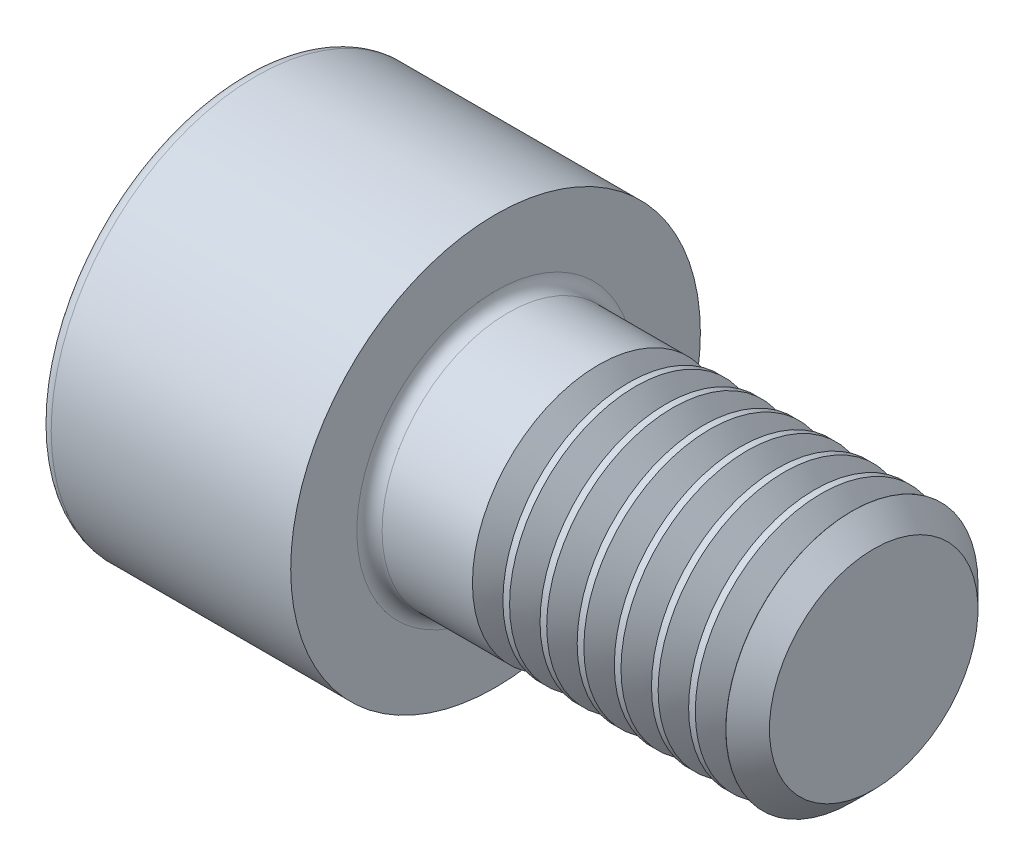
ISO-10303-21;
HEADER;
FILE_DESCRIPTION(('STEP AP214'),'2;1');
FILE_NAME('part.step','',(''),(''),'','','');
FILE_SCHEMA(('AUTOMOTIVE_DESIGN { 1 0 10303 214 1 1 1 1 }'));
ENDSEC;
DATA;
#1=APPLICATION_CONTEXT('core data for automotive mechanical design processes');
#2=APPLICATION_PROTOCOL_DEFINITION('international standard','automotive_design',2000,#1);
#3=PRODUCT_CONTEXT('',#1,'mechanical');
#4=PRODUCT('Part','Part','',(#3));
#5=PRODUCT_RELATED_PRODUCT_CATEGORY('part','',(#4));
#6=PRODUCT_DEFINITION_FORMATION('','',#4);
#7=PRODUCT_DEFINITION_CONTEXT('part definition',#1,'design');
#8=PRODUCT_DEFINITION('design','',#6,#7);
#9=PRODUCT_DEFINITION_SHAPE('','',#8);
#10=(LENGTH_UNIT() NAMED_UNIT(*) SI_UNIT(.MILLI.,.METRE.));
#11=(NAMED_UNIT(*) PLANE_ANGLE_UNIT() SI_UNIT($,.RADIAN.));
#12=(NAMED_UNIT(*) SI_UNIT($,.STERADIAN.) SOLID_ANGLE_UNIT());
#13=UNCERTAINTY_MEASURE_WITH_UNIT(LENGTH_MEASURE(1.E-05),#10,'distance_accuracy_value','');
#14=(GEOMETRIC_REPRESENTATION_CONTEXT(3) GLOBAL_UNCERTAINTY_ASSIGNED_CONTEXT((#13)) GLOBAL_UNIT_ASSIGNED_CONTEXT((#10,
#11,#12)) REPRESENTATION_CONTEXT('',''));
#15=CARTESIAN_POINT('',(0.,0.,0.));
#16=DIRECTION('',(0.,0.,1.));
#17=DIRECTION('',(1.,0.,0.));
#18=AXIS2_PLACEMENT_3D('',#15,#16,#17);
#19=CARTESIAN_POINT('',(5.759474945,0.,0.));
#20=DIRECTION('',(-1.,0.,0.));
#21=DIRECTION('',(0.,0.,1.));
#22=AXIS2_PLACEMENT_3D('',#19,#20,#21);
#23=CONICAL_SURFACE('',#22,0.,1.04719755128406);
#24=CARTESIAN_POINT('',(5.759474945,0.,0.));
#25=VERTEX_POINT('',#24);
#26=VERTEX_LOOP('',#25);
#27=FACE_BOUND('',#26,.T.);
#28=CARTESIAN_POINT('',(4.,0.,0.));
#29=DIRECTION('',(-1.,0.,0.));
#30=DIRECTION('',(0.,0.,1.));
#31=AXIS2_PLACEMENT_3D('',#28,#29,#30);
#32=CIRCLE('',#31,3.0475);
#33=CARTESIAN_POINT('',(4.,2.63921241786676,1.52375000025943));
#34=VERTEX_POINT('',#33);
#35=CARTESIAN_POINT('',(4.,2.63921241819937,-1.52374999968332));
#36=VERTEX_POINT('',#35);
#37=EDGE_CURVE('E88',#34,#36,#32,.T.);
#38=ORIENTED_EDGE('',*,*,#37,.T.);
#39=CARTESIAN_POINT('',(4.,0.,0.));
#40=DIRECTION('',(-1.,0.,0.));
#41=DIRECTION('',(0.,0.,1.));
#42=AXIS2_PLACEMENT_3D('',#39,#40,#41);
#43=CIRCLE('',#42,3.0475);
#44=CARTESIAN_POINT('',(4.,-6.2505269840047E-10,-3.0475));
#45=VERTEX_POINT('',#44);
#46=EDGE_CURVE('E91',#36,#45,#43,.T.);
#47=ORIENTED_EDGE('',*,*,#46,.T.);
#48=CARTESIAN_POINT('',(4.,0.,0.));
#49=DIRECTION('',(-1.,0.,0.));
#50=DIRECTION('',(0.,0.,1.));
#51=AXIS2_PLACEMENT_3D('',#48,#49,#50);
#52=CIRCLE('',#51,3.04749999999999);
#53=CARTESIAN_POINT('',(4.,-2.63921241806255,-1.5237499999203));
#54=VERTEX_POINT('',#53);
#55=EDGE_CURVE('E96',#45,#54,#52,.T.);
#56=ORIENTED_EDGE('',*,*,#55,.T.);
#57=CARTESIAN_POINT('',(4.,0.,0.));
#58=DIRECTION('',(-1.,0.,0.));
#59=DIRECTION('',(0.,0.,1.));
#60=AXIS2_PLACEMENT_3D('',#57,#58,#59);
#61=CIRCLE('',#60,3.0475);
#62=CARTESIAN_POINT('',(4.,-2.63921241788327,1.52375000020218));
#63=VERTEX_POINT('',#62);
#64=EDGE_CURVE('E225',#54,#63,#61,.T.);
#65=ORIENTED_EDGE('',*,*,#64,.T.);
#66=CARTESIAN_POINT('',(4.,0.,0.));
#67=DIRECTION('',(-1.,0.,0.));
#68=DIRECTION('',(0.,0.,1.));
#69=AXIS2_PLACEMENT_3D('',#66,#67,#68);
#70=CIRCLE('',#69,3.0475);
#71=CARTESIAN_POINT('',(4.,-2.73646082636564E-10,3.0475));
#72=VERTEX_POINT('',#71);
#73=EDGE_CURVE('E77',#63,#72,#70,.T.);
#74=ORIENTED_EDGE('',*,*,#73,.T.);
#75=CARTESIAN_POINT('',(4.,0.,0.));
#76=DIRECTION('',(-1.,0.,0.));
#77=DIRECTION('',(0.,0.,1.));
#78=AXIS2_PLACEMENT_3D('',#75,#76,#77);
#79=CIRCLE('',#78,3.0475);
#80=EDGE_CURVE('E20',#72,#34,#79,.T.);
#81=ORIENTED_EDGE('',*,*,#80,.T.);
#82=EDGE_LOOP('',(#38,#47,#56,#65,#74,#81));
#83=FACE_BOUND('',#82,.T.);
#84=ADVANCED_FACE('F16',(#27,#83),#23,.F.);
#85=CARTESIAN_POINT('',(4.,-0.015835275,3.0475));
#86=DIRECTION('',(1.,0.,0.));
#87=DIRECTION('',(0.,0.,-1.));
#88=AXIS2_PLACEMENT_3D('',#85,#86,#87);
#89=PLANE('',#88);
#90=DIRECTION('',(0.,-0.500000000137388,0.866025403705118));
#91=VECTOR('',#90,1.);
#92=CARTESIAN_POINT('',(4.,2.639212418,1.52375));
#93=LINE('',#92,#91);
#94=CARTESIAN_POINT('',(4.,1.75947494501155,3.04749999997999));
#95=VERTEX_POINT('',#94);
#96=EDGE_CURVE('E137',#34,#95,#93,.T.);
#97=ORIENTED_EDGE('',*,*,#96,.F.);
#98=ORIENTED_EDGE('',*,*,#80,.F.);
#99=DIRECTION('',(0.,1.,0.));
#100=VECTOR('',#99,1.);
#101=CARTESIAN_POINT('',(4.,0.,3.0475));
#102=LINE('',#101,#100);
#103=EDGE_CURVE('E179',#72,#95,#102,.T.);
#104=ORIENTED_EDGE('',*,*,#103,.T.);
#105=EDGE_LOOP('',(#97,#98,#104));
#106=FACE_BOUND('',#105,.T.);
#107=ADVANCED_FACE('F86',(#106),#89,.F.);
#108=CARTESIAN_POINT('',(4.,-2.655047693,3.0475));
#109=DIRECTION('',(1.,0.,0.));
#110=DIRECTION('',(0.,0.,-1.));
#111=AXIS2_PLACEMENT_3D('',#108,#109,#110);
#112=PLANE('',#111);
#113=DIRECTION('',(0.,1.,0.));
#114=VECTOR('',#113,1.);
#115=CARTESIAN_POINT('',(4.,0.,3.0475));
#116=LINE('',#115,#114);
#117=CARTESIAN_POINT('',(4.,-1.759474945,3.0475));
#118=VERTEX_POINT('',#117);
#119=EDGE_CURVE('E177',#118,#72,#116,.T.);
#120=ORIENTED_EDGE('',*,*,#119,.T.);
#121=ORIENTED_EDGE('',*,*,#73,.F.);
#122=DIRECTION('',(0.,-0.500000000137388,-0.866025403705118));
#123=VECTOR('',#122,1.);
#124=CARTESIAN_POINT('',(4.,-2.639212418,1.52375));
#125=LINE('',#124,#123);
#126=EDGE_CURVE('E164',#118,#63,#125,.T.);
#127=ORIENTED_EDGE('',*,*,#126,.F.);
#128=EDGE_LOOP('',(#120,#121,#127));
#129=FACE_BOUND('',#128,.T.);
#130=ADVANCED_FACE('F233',(#129),#112,.F.);
#131=CARTESIAN_POINT('',(4.,-3.524228316,1.542035));
#132=DIRECTION('',(1.,0.,0.));
#133=DIRECTION('',(0.,0.,-1.));
#134=AXIS2_PLACEMENT_3D('',#131,#132,#133);
#135=PLANE('',#134);
#136=DIRECTION('',(0.,-0.500000000137388,-0.866025403705118));
#137=VECTOR('',#136,1.);
#138=CARTESIAN_POINT('',(4.,-2.639212418,1.52375));
#139=LINE('',#138,#137);
#140=CARTESIAN_POINT('',(4.,-3.518949891,0.));
#141=VERTEX_POINT('',#140);
#142=EDGE_CURVE('E159',#63,#141,#139,.T.);
#143=ORIENTED_EDGE('',*,*,#142,.F.);
#144=ORIENTED_EDGE('',*,*,#64,.F.);
#145=DIRECTION('',(0.,0.500000000137388,-0.866025403705118));
#146=VECTOR('',#145,1.);
#147=CARTESIAN_POINT('',(4.,-2.639212418,-1.52375));
#148=LINE('',#147,#146);
#149=EDGE_CURVE('E146',#141,#54,#148,.T.);
#150=ORIENTED_EDGE('',*,*,#149,.F.);
#151=EDGE_LOOP('',(#143,#144,#150));
#152=FACE_BOUND('',#151,.T.);
#153=ADVANCED_FACE('F235',(#152),#135,.F.);
#154=CARTESIAN_POINT('',(4.,-2.655047693,-1.5146075));
#155=DIRECTION('',(1.,0.,0.));
#156=DIRECTION('',(0.,0.,-1.));
#157=AXIS2_PLACEMENT_3D('',#154,#155,#156);
#158=PLANE('',#157);
#159=DIRECTION('',(0.,0.500000000137388,-0.866025403705118));
#160=VECTOR('',#159,1.);
#161=CARTESIAN_POINT('',(4.,-2.639212418,-1.52375));
#162=LINE('',#161,#160);
#163=CARTESIAN_POINT('',(4.,-1.75947494501155,-3.04749999997999));
#164=VERTEX_POINT('',#163);
#165=EDGE_CURVE('E127',#54,#164,#162,.T.);
#166=ORIENTED_EDGE('',*,*,#165,.F.);
#167=ORIENTED_EDGE('',*,*,#55,.F.);
#168=DIRECTION('',(0.,-1.,0.));
#169=VECTOR('',#168,1.);
#170=CARTESIAN_POINT('',(4.,0.,-3.0475));
#171=LINE('',#170,#169);
#172=EDGE_CURVE('E126',#45,#164,#171,.T.);
#173=ORIENTED_EDGE('',*,*,#172,.T.);
#174=EDGE_LOOP('',(#166,#167,#173));
#175=FACE_BOUND('',#174,.T.);
#176=ADVANCED_FACE('F259',(#175),#158,.F.);
#177=CARTESIAN_POINT('',(4.,2.633933993,1.542035));
#178=DIRECTION('',(1.,0.,0.));
#179=DIRECTION('',(0.,0.,-1.));
#180=AXIS2_PLACEMENT_3D('',#177,#178,#179);
#181=PLANE('',#180);
#182=DIRECTION('',(0.,-0.500000000137388,-0.866025403705118));
#183=VECTOR('',#182,1.);
#184=CARTESIAN_POINT('',(4.,2.639212418,-1.52375));
#185=LINE('',#184,#183);
#186=CARTESIAN_POINT('',(4.,3.518949891,0.));
#187=VERTEX_POINT('',#186);
#188=EDGE_CURVE('E99',#187,#36,#185,.T.);
#189=ORIENTED_EDGE('',*,*,#188,.T.);
#190=ORIENTED_EDGE('',*,*,#37,.F.);
#191=DIRECTION('',(0.,-0.500000000137388,0.866025403705118));
#192=VECTOR('',#191,1.);
#193=CARTESIAN_POINT('',(4.,2.639212418,1.52375));
#194=LINE('',#193,#192);
#195=EDGE_CURVE('E102',#187,#34,#194,.T.);
#196=ORIENTED_EDGE('',*,*,#195,.F.);
#197=EDGE_LOOP('',(#189,#190,#196));
#198=FACE_BOUND('',#197,.T.);
#199=ADVANCED_FACE('F100',(#198),#181,.F.);
#200=CARTESIAN_POINT('',(4.,-0.015835275,-1.5146075));
#201=DIRECTION('',(1.,0.,0.));
#202=DIRECTION('',(0.,0.,-1.));
#203=AXIS2_PLACEMENT_3D('',#200,#201,#202);
#204=PLANE('',#203);
#205=DIRECTION('',(0.,-1.,0.));
#206=VECTOR('',#205,1.);
#207=CARTESIAN_POINT('',(4.,0.,-3.0475));
#208=LINE('',#207,#206);
#209=CARTESIAN_POINT('',(4.,1.7594749450462,-3.0475));
#210=VERTEX_POINT('',#209);
#211=EDGE_CURVE('E113',#210,#45,#208,.T.);
#212=ORIENTED_EDGE('',*,*,#211,.T.);
#213=ORIENTED_EDGE('',*,*,#46,.F.);
#214=DIRECTION('',(0.,-0.500000000137388,-0.866025403705118));
#215=VECTOR('',#214,1.);
#216=CARTESIAN_POINT('',(4.,2.639212418,-1.52375));
#217=LINE('',#216,#215);
#218=EDGE_CURVE('E107',#36,#210,#217,.T.);
#219=ORIENTED_EDGE('',*,*,#218,.T.);
#220=EDGE_LOOP('',(#212,#213,#219));
#221=FACE_BOUND('',#220,.T.);
#222=ADVANCED_FACE('F112',(#221),#204,.F.);
#223=CARTESIAN_POINT('',(0.,1.759474945,3.0475));
#224=DIRECTION('',(0.,-0.866025403705118,-0.500000000137388));
#225=DIRECTION('',(0.,0.500000000137388,-0.866025403705118));
#226=AXIS2_PLACEMENT_3D('',#223,#224,#225);
#227=PLANE('',#226);
#228=ORIENTED_EDGE('',*,*,#96,.T.);
#229=DIRECTION('',(-1.,0.,0.));
#230=VECTOR('',#229,1.);
#231=CARTESIAN_POINT('',(2.,1.759474945,3.0475));
#232=LINE('',#231,#230);
#233=CARTESIAN_POINT('',(0.,1.75947494497842,3.04750000034787));
#234=VERTEX_POINT('',#233);
#235=EDGE_CURVE('E174',#95,#234,#232,.T.);
#236=ORIENTED_EDGE('',*,*,#235,.T.);
#237=DIRECTION('',(0.,-0.499999999816707,0.866025403890263));
#238=VECTOR('',#237,1.);
#239=CARTESIAN_POINT('',(0.,3.5189498897344,0.));
#240=LINE('',#239,#238);
#241=CARTESIAN_POINT('',(0.,3.5189498901299,-1.37004802676075E-10));
#242=VERTEX_POINT('',#241);
#243=EDGE_CURVE('E118',#242,#234,#240,.T.);
#244=ORIENTED_EDGE('',*,*,#243,.F.);
#245=DIRECTION('',(1.,0.,0.));
#246=VECTOR('',#245,1.);
#247=CARTESIAN_POINT('',(2.,3.518949891,0.));
#248=LINE('',#247,#246);
#249=EDGE_CURVE('E108',#242,#187,#248,.T.);
#250=ORIENTED_EDGE('',*,*,#249,.T.);
#251=ORIENTED_EDGE('',*,*,#195,.T.);
#252=EDGE_LOOP('',(#228,#236,#244,#250,#251));
#253=FACE_BOUND('',#252,.T.);
#254=ADVANCED_FACE('F247',(#253),#227,.T.);
#255=CARTESIAN_POINT('',(0.,1.759474945,3.0475));
#256=DIRECTION('',(0.,0.,1.));
#257=DIRECTION('',(0.,-1.,0.));
#258=AXIS2_PLACEMENT_3D('',#255,#256,#257);
#259=PLANE('',#258);
#260=ORIENTED_EDGE('',*,*,#235,.F.);
#261=ORIENTED_EDGE('',*,*,#103,.F.);
#262=ORIENTED_EDGE('',*,*,#119,.F.);
#263=DIRECTION('',(1.,0.,0.));
#264=VECTOR('',#263,1.);
#265=CARTESIAN_POINT('',(2.,-1.759474945,3.0475));
#266=LINE('',#265,#264);
#267=CARTESIAN_POINT('',(0.,-1.75947494497842,3.04750000034787));
#268=VERTEX_POINT('',#267);
#269=EDGE_CURVE('E169',#268,#118,#266,.T.);
#270=ORIENTED_EDGE('',*,*,#269,.F.);
#271=DIRECTION('',(0.,-1.,0.));
#272=VECTOR('',#271,1.);
#273=CARTESIAN_POINT('',(0.,0.,3.047500000644));
#274=LINE('',#273,#272);
#275=EDGE_CURVE('E182',#234,#268,#274,.T.);
#276=ORIENTED_EDGE('',*,*,#275,.F.);
#277=EDGE_LOOP('',(#260,#261,#262,#270,#276));
#278=FACE_BOUND('',#277,.T.);
#279=ADVANCED_FACE('F243',(#278),#259,.F.);
#280=CARTESIAN_POINT('',(0.,-3.518949891,0.));
#281=DIRECTION('',(0.,0.866025403705118,-0.500000000137388));
#282=DIRECTION('',(0.,0.500000000137388,0.866025403705118));
#283=AXIS2_PLACEMENT_3D('',#280,#281,#282);
#284=PLANE('',#283);
#285=ORIENTED_EDGE('',*,*,#142,.T.);
#286=DIRECTION('',(1.,0.,0.));
#287=VECTOR('',#286,1.);
#288=CARTESIAN_POINT('',(2.,-3.518949891,0.));
#289=LINE('',#288,#287);
#290=CARTESIAN_POINT('',(0.,-3.5189498901299,-1.37005424366565E-10));
#291=VERTEX_POINT('',#290);
#292=EDGE_CURVE('E154',#291,#141,#289,.T.);
#293=ORIENTED_EDGE('',*,*,#292,.F.);
#294=DIRECTION('',(0.,-0.499999999816707,-0.866025403890263));
#295=VECTOR('',#294,1.);
#296=CARTESIAN_POINT('',(0.,-1.7594749448672,3.047500000644));
#297=LINE('',#296,#295);
#298=EDGE_CURVE('E185',#268,#291,#297,.T.);
#299=ORIENTED_EDGE('',*,*,#298,.F.);
#300=ORIENTED_EDGE('',*,*,#269,.T.);
#301=ORIENTED_EDGE('',*,*,#126,.T.);
#302=EDGE_LOOP('',(#285,#293,#299,#300,#301));
#303=FACE_BOUND('',#302,.T.);
#304=ADVANCED_FACE('F237',(#303),#284,.T.);
#305=CARTESIAN_POINT('',(0.,-1.759474945,-3.0475));
#306=DIRECTION('',(0.,0.866025403705118,0.500000000137388));
#307=DIRECTION('',(0.,-0.500000000137388,0.866025403705118));
#308=AXIS2_PLACEMENT_3D('',#305,#306,#307);
#309=PLANE('',#308);
#310=ORIENTED_EDGE('',*,*,#165,.T.);
#311=DIRECTION('',(-1.,0.,0.));
#312=VECTOR('',#311,1.);
#313=CARTESIAN_POINT('',(2.,-1.759474945,-3.0475));
#314=LINE('',#313,#312);
#315=CARTESIAN_POINT('',(0.,-1.75947494497842,-3.04750000034787));
#316=VERTEX_POINT('',#315);
#317=EDGE_CURVE('E133',#164,#316,#314,.T.);
#318=ORIENTED_EDGE('',*,*,#317,.T.);
#319=DIRECTION('',(0.,0.499999999816707,-0.866025403890263));
#320=VECTOR('',#319,1.);
#321=CARTESIAN_POINT('',(0.,-3.5189498897344,0.));
#322=LINE('',#321,#320);
#323=EDGE_CURVE('E200',#291,#316,#322,.T.);
#324=ORIENTED_EDGE('',*,*,#323,.F.);
#325=ORIENTED_EDGE('',*,*,#292,.T.);
#326=ORIENTED_EDGE('',*,*,#149,.T.);
#327=EDGE_LOOP('',(#310,#318,#324,#325,#326));
#328=FACE_BOUND('',#327,.T.);
#329=ADVANCED_FACE('F257',(#328),#309,.T.);
#330=CARTESIAN_POINT('',(0.,-1.759474945,-3.0475));
#331=DIRECTION('',(0.,0.,-1.));
#332=DIRECTION('',(0.,1.,0.));
#333=AXIS2_PLACEMENT_3D('',#330,#331,#332);
#334=PLANE('',#333);
#335=ORIENTED_EDGE('',*,*,#317,.F.);
#336=ORIENTED_EDGE('',*,*,#172,.F.);
#337=ORIENTED_EDGE('',*,*,#211,.F.);
#338=DIRECTION('',(-1.,0.,0.));
#339=VECTOR('',#338,1.);
#340=CARTESIAN_POINT('',(2.,1.759474945,-3.0475));
#341=LINE('',#340,#339);
#342=CARTESIAN_POINT('',(0.,1.75947494497842,-3.04750000034787));
#343=VERTEX_POINT('',#342);
#344=EDGE_CURVE('E35',#210,#343,#341,.T.);
#345=ORIENTED_EDGE('',*,*,#344,.T.);
#346=DIRECTION('',(0.,1.,0.));
#347=VECTOR('',#346,1.);
#348=CARTESIAN_POINT('',(0.,0.,-3.047500000644));
#349=LINE('',#348,#347);
#350=EDGE_CURVE('E196',#316,#343,#349,.T.);
#351=ORIENTED_EDGE('',*,*,#350,.F.);
#352=EDGE_LOOP('',(#335,#336,#337,#345,#351));
#353=FACE_BOUND('',#352,.T.);
#354=ADVANCED_FACE('F253',(#353),#334,.F.);
#355=CARTESIAN_POINT('',(0.,1.759474945,-3.0475));
#356=DIRECTION('',(0.,0.866025403705118,-0.500000000137388));
#357=DIRECTION('',(0.,0.500000000137388,0.866025403705118));
#358=AXIS2_PLACEMENT_3D('',#355,#356,#357);
#359=PLANE('',#358);
#360=ORIENTED_EDGE('',*,*,#344,.F.);
#361=ORIENTED_EDGE('',*,*,#218,.F.);
#362=ORIENTED_EDGE('',*,*,#188,.F.);
#363=ORIENTED_EDGE('',*,*,#249,.F.);
#364=DIRECTION('',(0.,0.499999999816707,0.866025403890263));
#365=VECTOR('',#364,1.);
#366=CARTESIAN_POINT('',(0.,1.7594749448672,-3.047500000644));
#367=LINE('',#366,#365);
#368=EDGE_CURVE('E199',#343,#242,#367,.T.);
#369=ORIENTED_EDGE('',*,*,#368,.F.);
#370=EDGE_LOOP('',(#360,#361,#362,#363,#369));
#371=FACE_BOUND('',#370,.T.);
#372=ADVANCED_FACE('F116',(#371),#359,.F.);
#373=CARTESIAN_POINT('',(0.,-6.1732,-6.1732));
#374=DIRECTION('',(-1.,0.,0.));
#375=DIRECTION('',(0.,0.,1.));
#376=AXIS2_PLACEMENT_3D('',#373,#374,#375);
#377=PLANE('',#376);
#378=ORIENTED_EDGE('',*,*,#350,.T.);
#379=ORIENTED_EDGE('',*,*,#368,.T.);
#380=ORIENTED_EDGE('',*,*,#243,.T.);
#381=ORIENTED_EDGE('',*,*,#275,.T.);
#382=ORIENTED_EDGE('',*,*,#298,.T.);
#383=ORIENTED_EDGE('',*,*,#323,.T.);
#384=EDGE_LOOP('',(#378,#379,#380,#381,#382,#383));
#385=FACE_BOUND('',#384,.T.);
#386=CARTESIAN_POINT('',(1.10787518482064E-10,0.,0.));
#387=DIRECTION('',(-1.,0.,0.));
#388=DIRECTION('',(0.,0.,1.));
#389=AXIS2_PLACEMENT_3D('',#386,#387,#388);
#390=CIRCLE('',#389,6.09999999965447);
#391=CARTESIAN_POINT('',(1.10787518482064E-10,0.,6.09999999965447));
#392=VERTEX_POINT('',#391);
#393=EDGE_CURVE('E213',#392,#392,#390,.F.);
#394=ORIENTED_EDGE('',*,*,#393,.F.);
#395=EDGE_LOOP('',(#394));
#396=FACE_BOUND('',#395,.T.);
#397=ADVANCED_FACE('F249',(#385,#396),#377,.T.);
#398=CARTESIAN_POINT('',(0.40000000032627,0.,0.));
#399=DIRECTION('',(-1.,0.,0.));
#400=DIRECTION('',(0.,0.,1.));
#401=AXIS2_PLACEMENT_3D('',#398,#399,#400);
#402=TOROIDAL_SURFACE('',#401,6.09999999967373,0.400000000215483);
#403=CARTESIAN_POINT('',(0.399999999999998,0.,0.));
#404=DIRECTION('',(-1.,0.,0.));
#405=DIRECTION('',(0.,0.,1.));
#406=AXIS2_PLACEMENT_3D('',#403,#404,#405);
#407=CIRCLE('',#406,6.5);
#408=CARTESIAN_POINT('',(0.4,0.,6.5));
#409=VERTEX_POINT('',#408);
#410=EDGE_CURVE('E212',#409,#409,#407,.T.);
#411=ORIENTED_EDGE('',*,*,#410,.T.);
#412=EDGE_LOOP('',(#411));
#413=FACE_BOUND('',#412,.T.);
#414=ORIENTED_EDGE('',*,*,#393,.T.);
#415=EDGE_LOOP('',(#414));
#416=FACE_BOUND('',#415,.T.);
#417=ADVANCED_FACE('F370',(#413,#416),#402,.T.);
#418=CARTESIAN_POINT('',(8.,0.,0.));
#419=DIRECTION('',(-1.,0.,0.));
#420=DIRECTION('',(0.,0.,1.));
#421=AXIS2_PLACEMENT_3D('',#418,#419,#420);
#422=CYLINDRICAL_SURFACE('',#421,6.5);
#423=CARTESIAN_POINT('',(8.,0.,0.));
#424=DIRECTION('',(-1.,0.,0.));
#425=DIRECTION('',(0.,0.,1.));
#426=AXIS2_PLACEMENT_3D('',#423,#424,#425);
#427=CIRCLE('',#426,6.5);
#428=CARTESIAN_POINT('',(8.,0.,6.5));
#429=VERTEX_POINT('',#428);
#430=EDGE_CURVE('E209',#429,#429,#427,.F.);
#431=ORIENTED_EDGE('',*,*,#430,.F.);
#432=EDGE_LOOP('',(#431));
#433=FACE_BOUND('',#432,.T.);
#434=ORIENTED_EDGE('',*,*,#410,.F.);
#435=EDGE_LOOP('',(#434));
#436=FACE_BOUND('',#435,.T.);
#437=ADVANCED_FACE('F367',(#433,#436),#422,.T.);
#438=CARTESIAN_POINT('',(8.,-6.578,6.578));
#439=DIRECTION('',(1.,0.,0.));
#440=DIRECTION('',(0.,0.,-1.));
#441=AXIS2_PLACEMENT_3D('',#438,#439,#440);
#442=PLANE('',#441);
#443=CARTESIAN_POINT('',(8.00000000011079,0.,0.));
#444=DIRECTION('',(1.,0.,0.));
#445=DIRECTION('',(0.,0.,-1.));
#446=AXIS2_PLACEMENT_3D('',#443,#444,#445);
#447=CIRCLE('',#446,4.40000000034549);
#448=CARTESIAN_POINT('',(8.00000000011079,0.,-4.40000000034549));
#449=VERTEX_POINT('',#448);
#450=EDGE_CURVE('E205',#449,#449,#447,.F.);
#451=ORIENTED_EDGE('',*,*,#450,.T.);
#452=EDGE_LOOP('',(#451));
#453=FACE_BOUND('',#452,.T.);
#454=ORIENTED_EDGE('',*,*,#430,.T.);
#455=EDGE_LOOP('',(#454));
#456=FACE_BOUND('',#455,.T.);
#457=ADVANCED_FACE('F369',(#453,#456),#442,.T.);
#458=CARTESIAN_POINT('',(8.40000000032627,0.,0.));
#459=DIRECTION('',(1.,0.,0.));
#460=DIRECTION('',(0.,0.,-1.));
#461=AXIS2_PLACEMENT_3D('',#458,#459,#460);
#462=TOROIDAL_SURFACE('',#461,4.40000000032627,0.400000000215483);
#463=ORIENTED_EDGE('',*,*,#450,.F.);
#464=EDGE_LOOP('',(#463));
#465=FACE_BOUND('',#464,.T.);
#466=CARTESIAN_POINT('',(8.4,0.,0.));
#467=DIRECTION('',(-1.,0.,0.));
#468=DIRECTION('',(0.,0.,1.));
#469=AXIS2_PLACEMENT_3D('',#466,#467,#468);
#470=CIRCLE('',#469,4.);
#471=CARTESIAN_POINT('',(8.4,0.,4.));
#472=VERTEX_POINT('',#471);
#473=EDGE_CURVE('E208',#472,#472,#470,.T.);
#474=ORIENTED_EDGE('',*,*,#473,.T.);
#475=EDGE_LOOP('',(#474));
#476=FACE_BOUND('',#475,.T.);
#477=ADVANCED_FACE('F365',(#465,#476),#462,.F.);
#478=CARTESIAN_POINT('',(11.266506695,0.,0.));
#479=DIRECTION('',(-1.,0.,0.));
#480=DIRECTION('',(0.,0.,1.));
#481=AXIS2_PLACEMENT_3D('',#478,#479,#480);
#482=CYLINDRICAL_SURFACE('',#481,4.);
#483=CARTESIAN_POINT('',(11.266506695,0.,0.));
#484=DIRECTION('',(-1.,0.,0.));
#485=DIRECTION('',(0.,-1.,0.));
#486=AXIS2_PLACEMENT_3D('',#483,#484,#485);
#487=CIRCLE('',#486,4.);
#488=CARTESIAN_POINT('',(11.266506695,-4.,0.));
#489=VERTEX_POINT('',#488);
#490=EDGE_CURVE('E652',#489,#489,#487,.T.);
#491=ORIENTED_EDGE('',*,*,#490,.T.);
#492=EDGE_LOOP('',(#491));
#493=FACE_BOUND('',#492,.T.);
#494=ORIENTED_EDGE('',*,*,#473,.F.);
#495=EDGE_LOOP('',(#494));
#496=FACE_BOUND('',#495,.T.);
#497=ADVANCED_FACE('F361',(#493,#496),#482,.T.);
#498=CARTESIAN_POINT('',(11.75,0.,0.));
#499=DIRECTION('',(-1.,0.,0.));
#500=DIRECTION('',(0.,0.,1.));
#501=AXIS2_PLACEMENT_3D('',#498,#499,#500);
#502=CONICAL_SURFACE('',#501,3.3095,0.959931088726912);
#503=CARTESIAN_POINT('',(11.75,0.,0.));
#504=DIRECTION('',(1.,0.,0.));
#505=DIRECTION('',(0.,1.,0.));
#506=AXIS2_PLACEMENT_3D('',#503,#504,#505);
#507=CIRCLE('',#506,3.3095);
#508=CARTESIAN_POINT('',(11.75,3.3095,0.));
#509=VERTEX_POINT('',#508);
#510=EDGE_CURVE('E655',#509,#509,#507,.F.);
#511=ORIENTED_EDGE('',*,*,#510,.T.);
#512=EDGE_LOOP('',(#511));
#513=FACE_BOUND('',#512,.T.);
#514=ORIENTED_EDGE('',*,*,#490,.F.);
#515=EDGE_LOOP('',(#514));
#516=FACE_BOUND('',#515,.T.);
#517=ADVANCED_FACE('F357',(#513,#516),#502,.T.);
#518=CARTESIAN_POINT('',(11.75,0.,0.));
#519=DIRECTION('',(1.,0.,0.));
#520=DIRECTION('',(0.,0.,-1.));
#521=AXIS2_PLACEMENT_3D('',#518,#519,#520);
#522=CONICAL_SURFACE('',#521,3.3095,0.959931088726909);
#523=ORIENTED_EDGE('',*,*,#510,.F.);
#524=EDGE_LOOP('',(#523));
#525=FACE_BOUND('',#524,.T.);
#526=CARTESIAN_POINT('',(12.233493305,0.,0.));
#527=DIRECTION('',(-1.,0.,0.));
#528=DIRECTION('',(0.,0.,1.));
#529=AXIS2_PLACEMENT_3D('',#526,#527,#528);
#530=CIRCLE('',#529,4.);
#531=CARTESIAN_POINT('',(12.233493305,0.,4.));
#532=VERTEX_POINT('',#531);
#533=EDGE_CURVE('E666',#532,#532,#530,.T.);
#534=ORIENTED_EDGE('',*,*,#533,.T.);
#535=EDGE_LOOP('',(#534));
#536=FACE_BOUND('',#535,.T.);
#537=ADVANCED_FACE('F353',(#525,#536),#522,.T.);
#538=CARTESIAN_POINT('',(12.445078123,0.,0.));
#539=DIRECTION('',(-1.,0.,0.));
#540=DIRECTION('',(0.,-1.,0.));
#541=AXIS2_PLACEMENT_3D('',#538,#539,#540);
#542=CYLINDRICAL_SURFACE('',#541,4.);
#543=ORIENTED_EDGE('',*,*,#533,.F.);
#544=EDGE_LOOP('',(#543));
#545=FACE_BOUND('',#544,.T.);
#546=CARTESIAN_POINT('',(12.4450781230001,0.,0.));
#547=DIRECTION('',(-1.,0.,0.));
#548=DIRECTION('',(0.,-1.,0.));
#549=AXIS2_PLACEMENT_3D('',#546,#547,#548);
#550=CIRCLE('',#549,4.);
#551=CARTESIAN_POINT('',(12.445078123,-4.,0.));
#552=VERTEX_POINT('',#551);
#553=EDGE_CURVE('E669',#552,#552,#550,.T.);
#554=ORIENTED_EDGE('',*,*,#553,.T.);
#555=EDGE_LOOP('',(#554));
#556=FACE_BOUND('',#555,.T.);
#557=ADVANCED_FACE('F349',(#545,#556),#542,.T.);
#558=CARTESIAN_POINT('',(12.928571429,0.,0.));
#559=DIRECTION('',(-1.,0.,0.));
#560=DIRECTION('',(0.,0.,1.));
#561=AXIS2_PLACEMENT_3D('',#558,#559,#560);
#562=CONICAL_SURFACE('',#561,3.3095,0.959931087755136);
#563=ORIENTED_EDGE('',*,*,#553,.F.);
#564=EDGE_LOOP('',(#563));
#565=FACE_BOUND('',#564,.T.);
#566=CARTESIAN_POINT('',(12.9285714289999,0.,0.));
#567=DIRECTION('',(1.,0.,0.));
#568=DIRECTION('',(0.,1.,0.));
#569=AXIS2_PLACEMENT_3D('',#566,#567,#568);
#570=CIRCLE('',#569,3.3095);
#571=CARTESIAN_POINT('',(12.928571429,3.3095,0.));
#572=VERTEX_POINT('',#571);
#573=EDGE_CURVE('E672',#572,#572,#570,.F.);
#574=ORIENTED_EDGE('',*,*,#573,.T.);
#575=EDGE_LOOP('',(#574));
#576=FACE_BOUND('',#575,.T.);
#577=ADVANCED_FACE('F345',(#565,#576),#562,.T.);
#578=CARTESIAN_POINT('',(12.928571429,0.,0.));
#579=DIRECTION('',(1.,0.,0.));
#580=DIRECTION('',(0.,0.,-1.));
#581=AXIS2_PLACEMENT_3D('',#578,#579,#580);
#582=CONICAL_SURFACE('',#581,3.3095,0.959931088726907);
#583=CARTESIAN_POINT('',(13.412064734,0.,0.));
#584=DIRECTION('',(-1.,0.,0.));
#585=DIRECTION('',(0.,0.,1.));
#586=AXIS2_PLACEMENT_3D('',#583,#584,#585);
#587=CIRCLE('',#586,4.);
#588=CARTESIAN_POINT('',(13.412064734,0.,4.));
#589=VERTEX_POINT('',#588);
#590=EDGE_CURVE('E675',#589,#589,#587,.T.);
#591=ORIENTED_EDGE('',*,*,#590,.T.);
#592=EDGE_LOOP('',(#591));
#593=FACE_BOUND('',#592,.T.);
#594=ORIENTED_EDGE('',*,*,#573,.F.);
#595=EDGE_LOOP('',(#594));
#596=FACE_BOUND('',#595,.T.);
#597=ADVANCED_FACE('F341',(#593,#596),#582,.T.);
#598=CARTESIAN_POINT('',(13.623649552,0.,0.));
#599=DIRECTION('',(-1.,0.,0.));
#600=DIRECTION('',(0.,-1.,0.));
#601=AXIS2_PLACEMENT_3D('',#598,#599,#600);
#602=CYLINDRICAL_SURFACE('',#601,4.);
#603=CARTESIAN_POINT('',(13.6236495519999,0.,0.));
#604=DIRECTION('',(-1.,0.,0.));
#605=DIRECTION('',(0.,-1.,0.));
#606=AXIS2_PLACEMENT_3D('',#603,#604,#605);
#607=CIRCLE('',#606,4.);
#608=CARTESIAN_POINT('',(13.623649552,-4.,0.));
#609=VERTEX_POINT('',#608);
#610=EDGE_CURVE('E678',#609,#609,#607,.T.);
#611=ORIENTED_EDGE('',*,*,#610,.T.);
#612=EDGE_LOOP('',(#611));
#613=FACE_BOUND('',#612,.T.);
#614=ORIENTED_EDGE('',*,*,#590,.F.);
#615=EDGE_LOOP('',(#614));
#616=FACE_BOUND('',#615,.T.);
#617=ADVANCED_FACE('F337',(#613,#616),#602,.T.);
#618=CARTESIAN_POINT('',(14.107142857,0.,0.));
#619=DIRECTION('',(-1.,0.,0.));
#620=DIRECTION('',(0.,0.,1.));
#621=AXIS2_PLACEMENT_3D('',#618,#619,#620);
#622=CONICAL_SURFACE('',#621,3.3095,0.959931088726909);
#623=CARTESIAN_POINT('',(14.107142857,0.,0.));
#624=DIRECTION('',(1.,0.,0.));
#625=DIRECTION('',(0.,1.,0.));
#626=AXIS2_PLACEMENT_3D('',#623,#624,#625);
#627=CIRCLE('',#626,3.3095);
#628=CARTESIAN_POINT('',(14.107142857,3.3095,0.));
#629=VERTEX_POINT('',#628);
#630=EDGE_CURVE('E681',#629,#629,#627,.F.);
#631=ORIENTED_EDGE('',*,*,#630,.T.);
#632=EDGE_LOOP('',(#631));
#633=FACE_BOUND('',#632,.T.);
#634=ORIENTED_EDGE('',*,*,#610,.F.);
#635=EDGE_LOOP('',(#634));
#636=FACE_BOUND('',#635,.T.);
#637=ADVANCED_FACE('F333',(#633,#636),#622,.T.);
#638=CARTESIAN_POINT('',(14.107142857,0.,0.));
#639=DIRECTION('',(1.,0.,0.));
#640=DIRECTION('',(0.,0.,-1.));
#641=AXIS2_PLACEMENT_3D('',#638,#639,#640);
#642=CONICAL_SURFACE('',#641,3.3095,0.95993108872691);
#643=ORIENTED_EDGE('',*,*,#630,.F.);
#644=EDGE_LOOP('',(#643));
#645=FACE_BOUND('',#644,.T.);
#646=CARTESIAN_POINT('',(14.590636162,0.,0.));
#647=DIRECTION('',(-1.,0.,0.));
#648=DIRECTION('',(0.,0.,1.));
#649=AXIS2_PLACEMENT_3D('',#646,#647,#648);
#650=CIRCLE('',#649,4.);
#651=CARTESIAN_POINT('',(14.590636162,0.,4.));
#652=VERTEX_POINT('',#651);
#653=EDGE_CURVE('E684',#652,#652,#650,.T.);
#654=ORIENTED_EDGE('',*,*,#653,.T.);
#655=EDGE_LOOP('',(#654));
#656=FACE_BOUND('',#655,.T.);
#657=ADVANCED_FACE('F329',(#645,#656),#642,.T.);
#658=CARTESIAN_POINT('',(14.802220981,0.,0.));
#659=DIRECTION('',(-1.,0.,0.));
#660=DIRECTION('',(0.,-1.,0.));
#661=AXIS2_PLACEMENT_3D('',#658,#659,#660);
#662=CYLINDRICAL_SURFACE('',#661,4.);
#663=ORIENTED_EDGE('',*,*,#653,.F.);
#664=EDGE_LOOP('',(#663));
#665=FACE_BOUND('',#664,.T.);
#666=CARTESIAN_POINT('',(14.8022209809999,0.,0.));
#667=DIRECTION('',(-1.,0.,0.));
#668=DIRECTION('',(0.,-1.,0.));
#669=AXIS2_PLACEMENT_3D('',#666,#667,#668);
#670=CIRCLE('',#669,4.);
#671=CARTESIAN_POINT('',(14.802220981,-4.,0.));
#672=VERTEX_POINT('',#671);
#673=EDGE_CURVE('E687',#672,#672,#670,.T.);
#674=ORIENTED_EDGE('',*,*,#673,.T.);
#675=EDGE_LOOP('',(#674));
#676=FACE_BOUND('',#675,.T.);
#677=ADVANCED_FACE('F325',(#665,#676),#662,.T.);
#678=CARTESIAN_POINT('',(15.285714286,0.,0.));
#679=DIRECTION('',(-1.,0.,0.));
#680=DIRECTION('',(0.,0.,1.));
#681=AXIS2_PLACEMENT_3D('',#678,#679,#680);
#682=CONICAL_SURFACE('',#681,3.3095,0.959931088726907);
#683=ORIENTED_EDGE('',*,*,#673,.F.);
#684=EDGE_LOOP('',(#683));
#685=FACE_BOUND('',#684,.T.);
#686=CARTESIAN_POINT('',(15.285714286,0.,0.));
#687=DIRECTION('',(1.,0.,0.));
#688=DIRECTION('',(0.,1.,0.));
#689=AXIS2_PLACEMENT_3D('',#686,#687,#688);
#690=CIRCLE('',#689,3.3095);
#691=CARTESIAN_POINT('',(15.285714286,3.3095,0.));
#692=VERTEX_POINT('',#691);
#693=EDGE_CURVE('E690',#692,#692,#690,.F.);
#694=ORIENTED_EDGE('',*,*,#693,.T.);
#695=EDGE_LOOP('',(#694));
#696=FACE_BOUND('',#695,.T.);
#697=ADVANCED_FACE('F321',(#685,#696),#682,.T.);
#698=CARTESIAN_POINT('',(15.285714286,0.,0.));
#699=DIRECTION('',(1.,0.,0.));
#700=DIRECTION('',(0.,0.,-1.));
#701=AXIS2_PLACEMENT_3D('',#698,#699,#700);
#702=CONICAL_SURFACE('',#701,3.3095,0.959931088726912);
#703=CARTESIAN_POINT('',(15.769207591,0.,0.));
#704=DIRECTION('',(-1.,0.,0.));
#705=DIRECTION('',(0.,0.,1.));
#706=AXIS2_PLACEMENT_3D('',#703,#704,#705);
#707=CIRCLE('',#706,4.);
#708=CARTESIAN_POINT('',(15.769207591,0.,4.));
#709=VERTEX_POINT('',#708);
#710=EDGE_CURVE('E693',#709,#709,#707,.T.);
#711=ORIENTED_EDGE('',*,*,#710,.T.);
#712=EDGE_LOOP('',(#711));
#713=FACE_BOUND('',#712,.T.);
#714=ORIENTED_EDGE('',*,*,#693,.F.);
#715=EDGE_LOOP('',(#714));
#716=FACE_BOUND('',#715,.T.);
#717=ADVANCED_FACE('F317',(#713,#716),#702,.T.);
#718=CARTESIAN_POINT('',(15.980792409,0.,0.));
#719=DIRECTION('',(-1.,0.,0.));
#720=DIRECTION('',(0.,0.,1.));
#721=AXIS2_PLACEMENT_3D('',#718,#719,#720);
#722=CYLINDRICAL_SURFACE('',#721,4.);
#723=CARTESIAN_POINT('',(15.9807924090001,0.,0.));
#724=DIRECTION('',(-1.,0.,0.));
#725=DIRECTION('',(0.,-1.,0.));
#726=AXIS2_PLACEMENT_3D('',#723,#724,#725);
#727=CIRCLE('',#726,4.);
#728=CARTESIAN_POINT('',(15.980792409,-4.,0.));
#729=VERTEX_POINT('',#728);
#730=EDGE_CURVE('E696',#729,#729,#727,.T.);
#731=ORIENTED_EDGE('',*,*,#730,.T.);
#732=EDGE_LOOP('',(#731));
#733=FACE_BOUND('',#732,.T.);
#734=ORIENTED_EDGE('',*,*,#710,.F.);
#735=EDGE_LOOP('',(#734));
#736=FACE_BOUND('',#735,.T.);
#737=ADVANCED_FACE('F313',(#733,#736),#722,.T.);
#738=CARTESIAN_POINT('',(16.464285714,0.,0.));
#739=DIRECTION('',(-1.,0.,0.));
#740=DIRECTION('',(0.,0.,1.));
#741=AXIS2_PLACEMENT_3D('',#738,#739,#740);
#742=CONICAL_SURFACE('',#741,3.3095,0.959931088726907);
#743=CARTESIAN_POINT('',(16.464285714,0.,0.));
#744=DIRECTION('',(1.,0.,0.));
#745=DIRECTION('',(0.,1.,0.));
#746=AXIS2_PLACEMENT_3D('',#743,#744,#745);
#747=CIRCLE('',#746,3.3095);
#748=CARTESIAN_POINT('',(16.464285714,3.3095,0.));
#749=VERTEX_POINT('',#748);
#750=EDGE_CURVE('E699',#749,#749,#747,.F.);
#751=ORIENTED_EDGE('',*,*,#750,.T.);
#752=EDGE_LOOP('',(#751));
#753=FACE_BOUND('',#752,.T.);
#754=ORIENTED_EDGE('',*,*,#730,.F.);
#755=EDGE_LOOP('',(#754));
#756=FACE_BOUND('',#755,.T.);
#757=ADVANCED_FACE('F309',(#753,#756),#742,.T.);
#758=CARTESIAN_POINT('',(16.464285714,0.,0.));
#759=DIRECTION('',(1.,0.,0.));
#760=DIRECTION('',(0.,0.,-1.));
#761=AXIS2_PLACEMENT_3D('',#758,#759,#760);
#762=CONICAL_SURFACE('',#761,3.3095,0.959931088726914);
#763=ORIENTED_EDGE('',*,*,#750,.F.);
#764=EDGE_LOOP('',(#763));
#765=FACE_BOUND('',#764,.T.);
#766=CARTESIAN_POINT('',(16.947779019,0.,0.));
#767=DIRECTION('',(-1.,0.,0.));
#768=DIRECTION('',(0.,0.,1.));
#769=AXIS2_PLACEMENT_3D('',#766,#767,#768);
#770=CIRCLE('',#769,4.);
#771=CARTESIAN_POINT('',(16.947779019,0.,4.));
#772=VERTEX_POINT('',#771);
#773=EDGE_CURVE('E702',#772,#772,#770,.T.);
#774=ORIENTED_EDGE('',*,*,#773,.T.);
#775=EDGE_LOOP('',(#774));
#776=FACE_BOUND('',#775,.T.);
#777=ADVANCED_FACE('F305',(#765,#776),#762,.T.);
#778=CARTESIAN_POINT('',(17.159363838,0.,0.));
#779=DIRECTION('',(-1.,0.,0.));
#780=DIRECTION('',(0.,0.,1.));
#781=AXIS2_PLACEMENT_3D('',#778,#779,#780);
#782=CYLINDRICAL_SURFACE('',#781,4.);
#783=ORIENTED_EDGE('',*,*,#773,.F.);
#784=EDGE_LOOP('',(#783));
#785=FACE_BOUND('',#784,.T.);
#786=CARTESIAN_POINT('',(17.1593638380001,0.,0.));
#787=DIRECTION('',(-1.,0.,0.));
#788=DIRECTION('',(0.,-1.,0.));
#789=AXIS2_PLACEMENT_3D('',#786,#787,#788);
#790=CIRCLE('',#789,4.);
#791=CARTESIAN_POINT('',(17.159363838,-4.,0.));
#792=VERTEX_POINT('',#791);
#793=EDGE_CURVE('E705',#792,#792,#790,.T.);
#794=ORIENTED_EDGE('',*,*,#793,.T.);
#795=EDGE_LOOP('',(#794));
#796=FACE_BOUND('',#795,.T.);
#797=ADVANCED_FACE('F301',(#785,#796),#782,.T.);
#798=CARTESIAN_POINT('',(17.642857143,0.,0.));
#799=DIRECTION('',(-1.,0.,0.));
#800=DIRECTION('',(0.,0.,1.));
#801=AXIS2_PLACEMENT_3D('',#798,#799,#800);
#802=CONICAL_SURFACE('',#801,3.3095,0.959931088726903);
#803=ORIENTED_EDGE('',*,*,#793,.F.);
#804=EDGE_LOOP('',(#803));
#805=FACE_BOUND('',#804,.T.);
#806=CARTESIAN_POINT('',(17.642857143,0.,0.));
#807=DIRECTION('',(1.,0.,0.));
#808=DIRECTION('',(0.,1.,0.));
#809=AXIS2_PLACEMENT_3D('',#806,#807,#808);
#810=CIRCLE('',#809,3.3095);
#811=CARTESIAN_POINT('',(17.642857143,3.3095,0.));
#812=VERTEX_POINT('',#811);
#813=EDGE_CURVE('E708',#812,#812,#810,.F.);
#814=ORIENTED_EDGE('',*,*,#813,.T.);
#815=EDGE_LOOP('',(#814));
#816=FACE_BOUND('',#815,.T.);
#817=ADVANCED_FACE('F297',(#805,#816),#802,.T.);
#818=CARTESIAN_POINT('',(17.642857143,0.,0.));
#819=DIRECTION('',(1.,0.,0.));
#820=DIRECTION('',(0.,0.,-1.));
#821=AXIS2_PLACEMENT_3D('',#818,#819,#820);
#822=CONICAL_SURFACE('',#821,3.3095,0.95993108872691);
#823=CARTESIAN_POINT('',(18.126350448,0.,0.));
#824=DIRECTION('',(-1.,0.,0.));
#825=DIRECTION('',(0.,0.,1.));
#826=AXIS2_PLACEMENT_3D('',#823,#824,#825);
#827=CIRCLE('',#826,4.);
#828=CARTESIAN_POINT('',(18.126350448,0.,4.));
#829=VERTEX_POINT('',#828);
#830=EDGE_CURVE('E710',#829,#829,#827,.T.);
#831=ORIENTED_EDGE('',*,*,#830,.T.);
#832=EDGE_LOOP('',(#831));
#833=FACE_BOUND('',#832,.T.);
#834=ORIENTED_EDGE('',*,*,#813,.F.);
#835=EDGE_LOOP('',(#834));
#836=FACE_BOUND('',#835,.T.);
#837=ADVANCED_FACE('F293',(#833,#836),#822,.T.);
#838=CARTESIAN_POINT('',(18.337935266,0.,0.));
#839=DIRECTION('',(-1.,0.,0.));
#840=DIRECTION('',(0.,0.,1.));
#841=AXIS2_PLACEMENT_3D('',#838,#839,#840);
#842=CYLINDRICAL_SURFACE('',#841,4.);
#843=CARTESIAN_POINT('',(18.337935266,0.,0.));
#844=DIRECTION('',(-1.,0.,0.));
#845=DIRECTION('',(0.,-1.,0.));
#846=AXIS2_PLACEMENT_3D('',#843,#844,#845);
#847=CIRCLE('',#846,4.);
#848=CARTESIAN_POINT('',(18.337935266,-4.,0.));
#849=VERTEX_POINT('',#848);
#850=EDGE_CURVE('E714',#849,#849,#847,.T.);
#851=ORIENTED_EDGE('',*,*,#850,.T.);
#852=EDGE_LOOP('',(#851));
#853=FACE_BOUND('',#852,.T.);
#854=ORIENTED_EDGE('',*,*,#830,.F.);
#855=EDGE_LOOP('',(#854));
#856=FACE_BOUND('',#855,.T.);
#857=ADVANCED_FACE('F289',(#853,#856),#842,.T.);
#858=CARTESIAN_POINT('',(18.821428571,0.,0.));
#859=DIRECTION('',(-1.,0.,0.));
#860=DIRECTION('',(0.,0.,1.));
#861=AXIS2_PLACEMENT_3D('',#858,#859,#860);
#862=CONICAL_SURFACE('',#861,3.3095,0.959931088726917);
#863=CARTESIAN_POINT('',(18.821428571,0.,0.));
#864=DIRECTION('',(1.,0.,0.));
#865=DIRECTION('',(0.,1.,0.));
#866=AXIS2_PLACEMENT_3D('',#863,#864,#865);
#867=CIRCLE('',#866,3.3095);
#868=CARTESIAN_POINT('',(18.821428571,3.3095,0.));
#869=VERTEX_POINT('',#868);
#870=EDGE_CURVE('E204',#869,#869,#867,.F.);
#871=ORIENTED_EDGE('',*,*,#870,.T.);
#872=EDGE_LOOP('',(#871));
#873=FACE_BOUND('',#872,.T.);
#874=ORIENTED_EDGE('',*,*,#850,.F.);
#875=EDGE_LOOP('',(#874));
#876=FACE_BOUND('',#875,.T.);
#877=ADVANCED_FACE('F286',(#873,#876),#862,.T.);
#878=CARTESIAN_POINT('',(20.,-3.349214,3.349214));
#879=DIRECTION('',(1.,0.,0.));
#880=DIRECTION('',(0.,0.,-1.));
#881=AXIS2_PLACEMENT_3D('',#878,#879,#880);
#882=PLANE('',#881);
#883=CARTESIAN_POINT('',(20.,0.,0.));
#884=DIRECTION('',(-1.,0.,0.));
#885=DIRECTION('',(0.,-1.,0.));
#886=AXIS2_PLACEMENT_3D('',#883,#884,#885);
#887=CIRCLE('',#886,3.30949999999998);
#888=CARTESIAN_POINT('',(20.,-3.30949999999998,0.));
#889=VERTEX_POINT('',#888);
#890=EDGE_CURVE('E201',#889,#889,#887,.F.);
#891=ORIENTED_EDGE('',*,*,#890,.T.);
#892=EDGE_LOOP('',(#891));
#893=FACE_BOUND('',#892,.T.);
#894=ADVANCED_FACE('F18',(#893),#882,.T.);
#895=CARTESIAN_POINT('',(18.821428571,0.,0.));
#896=DIRECTION('',(1.,0.,0.));
#897=DIRECTION('',(0.,0.,-1.));
#898=AXIS2_PLACEMENT_3D('',#895,#896,#897);
#899=CONICAL_SURFACE('',#898,3.3095,0.959931087755131);
#900=ORIENTED_EDGE('',*,*,#870,.F.);
#901=EDGE_LOOP('',(#900));
#902=FACE_BOUND('',#901,.T.);
#903=CARTESIAN_POINT('',(19.304921877,0.,0.));
#904=DIRECTION('',(-1.,0.,0.));
#905=DIRECTION('',(0.,0.,1.));
#906=AXIS2_PLACEMENT_3D('',#903,#904,#905);
#907=CIRCLE('',#906,4.);
#908=CARTESIAN_POINT('',(19.304921877,0.,4.));
#909=VERTEX_POINT('',#908);
#910=EDGE_CURVE('E26',#909,#909,#907,.T.);
#911=ORIENTED_EDGE('',*,*,#910,.T.);
#912=EDGE_LOOP('',(#911));
#913=FACE_BOUND('',#912,.T.);
#914=ADVANCED_FACE('F277',(#902,#913),#899,.T.);
#915=CARTESIAN_POINT('',(20.,0.,0.));
#916=DIRECTION('',(-1.,0.,0.));
#917=DIRECTION('',(0.,-1.,0.));
#918=AXIS2_PLACEMENT_3D('',#915,#916,#917);
#919=CONICAL_SURFACE('',#918,3.3095,0.785398163397448);
#920=ORIENTED_EDGE('',*,*,#890,.F.);
#921=EDGE_LOOP('',(#920));
#922=FACE_BOUND('',#921,.T.);
#923=CARTESIAN_POINT('',(19.3095,0.,0.));
#924=DIRECTION('',(-1.,0.,0.));
#925=DIRECTION('',(0.,0.,1.));
#926=AXIS2_PLACEMENT_3D('',#923,#924,#925);
#927=CIRCLE('',#926,4.);
#928=CARTESIAN_POINT('',(19.3095,0.,4.));
#929=VERTEX_POINT('',#928);
#930=EDGE_CURVE('E11',#929,#929,#927,.F.);
#931=ORIENTED_EDGE('',*,*,#930,.T.);
#932=EDGE_LOOP('',(#931));
#933=FACE_BOUND('',#932,.T.);
#934=ADVANCED_FACE('F271',(#922,#933),#919,.T.);
#935=CARTESIAN_POINT('',(19.3095,0.,0.));
#936=DIRECTION('',(-1.,0.,0.));
#937=DIRECTION('',(0.,0.,1.));
#938=AXIS2_PLACEMENT_3D('',#935,#936,#937);
#939=CYLINDRICAL_SURFACE('',#938,4.);
#940=ORIENTED_EDGE('',*,*,#930,.F.);
#941=EDGE_LOOP('',(#940));
#942=FACE_BOUND('',#941,.T.);
#943=ORIENTED_EDGE('',*,*,#910,.F.);
#944=EDGE_LOOP('',(#943));
#945=FACE_BOUND('',#944,.T.);
#946=ADVANCED_FACE('F269',(#942,#945),#939,.T.);
#947=CLOSED_SHELL('',(#84,#107,#130,#153,#176,#199,#222,#254,#279,#304,#329,#354,#372,#397,#417,
#437,#457,#477,#497,#517,#537,#557,#577,#597,#617,#637,#657,#677,#697,#717,#737,#757,#777,#797,
#817,#837,#857,#877,#894,#914,#934,#946));
#948=MANIFOLD_SOLID_BREP('B1',#947);
#949=ADVANCED_BREP_SHAPE_REPRESENTATION('',(#18,#948),#14);
#950=SHAPE_DEFINITION_REPRESENTATION(#9,#949);
ENDSEC;
END-ISO-10303-21;
